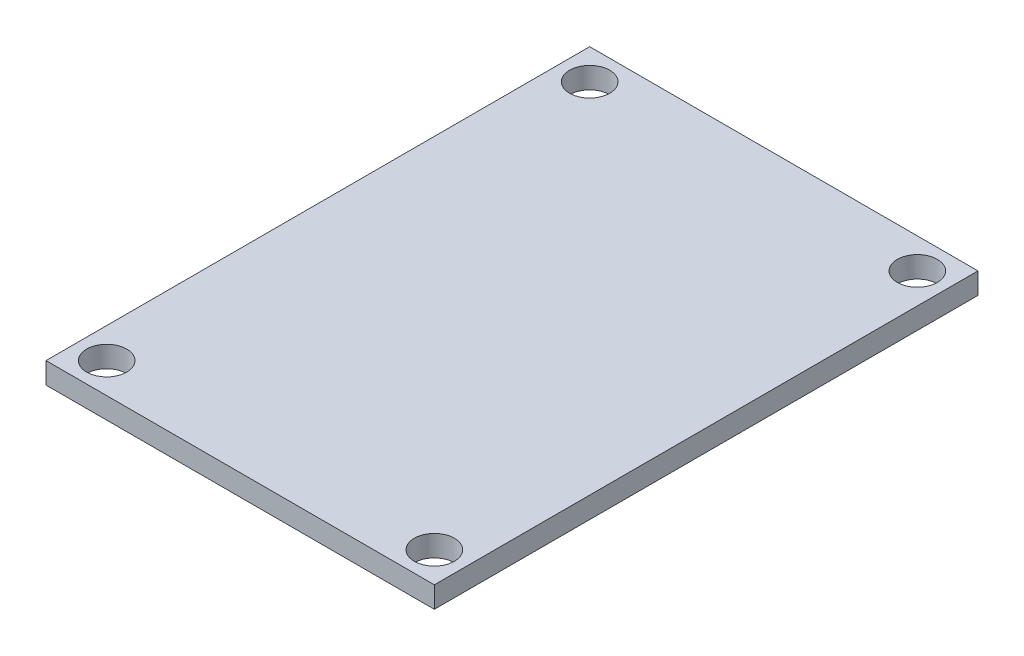
ISO-10303-21;
HEADER;
FILE_DESCRIPTION(('STEP AP214'),'2;1');
FILE_NAME('part.step','',(''),(''),'','','');
FILE_SCHEMA(('AUTOMOTIVE_DESIGN { 1 0 10303 214 1 1 1 1 }'));
ENDSEC;
DATA;
#1=APPLICATION_CONTEXT('core data for automotive mechanical design processes');
#2=APPLICATION_PROTOCOL_DEFINITION('international standard','automotive_design',2000,#1);
#3=PRODUCT_CONTEXT('',#1,'mechanical');
#4=PRODUCT('Part','Part','',(#3));
#5=PRODUCT_RELATED_PRODUCT_CATEGORY('part','',(#4));
#6=PRODUCT_DEFINITION_FORMATION('','',#4);
#7=PRODUCT_DEFINITION_CONTEXT('part definition',#1,'design');
#8=PRODUCT_DEFINITION('design','',#6,#7);
#9=PRODUCT_DEFINITION_SHAPE('','',#8);
#10=(LENGTH_UNIT() NAMED_UNIT(*) SI_UNIT(.MILLI.,.METRE.));
#11=(NAMED_UNIT(*) PLANE_ANGLE_UNIT() SI_UNIT($,.RADIAN.));
#12=(NAMED_UNIT(*) SI_UNIT($,.STERADIAN.) SOLID_ANGLE_UNIT());
#13=UNCERTAINTY_MEASURE_WITH_UNIT(LENGTH_MEASURE(1.E-05),#10,'distance_accuracy_value','');
#14=(GEOMETRIC_REPRESENTATION_CONTEXT(3) GLOBAL_UNCERTAINTY_ASSIGNED_CONTEXT((#13)) GLOBAL_UNIT_ASSIGNED_CONTEXT((#10,
#11,#12)) REPRESENTATION_CONTEXT('',''));
#15=CARTESIAN_POINT('',(0.,0.,0.));
#16=DIRECTION('',(0.,0.,1.));
#17=DIRECTION('',(1.,0.,0.));
#18=AXIS2_PLACEMENT_3D('',#15,#16,#17);
#19=CARTESIAN_POINT('',(0.,1.75,0.));
#20=DIRECTION('',(0.,1.,0.));
#21=DIRECTION('',(0.,0.,1.));
#22=AXIS2_PLACEMENT_3D('',#19,#20,#21);
#23=PLANE('',#22);
#24=CARTESIAN_POINT('',(13.5,1.75,19.9));
#25=DIRECTION('',(0.,1.,0.));
#26=DIRECTION('',(0.,0.,1.));
#27=AXIS2_PLACEMENT_3D('',#24,#25,#26);
#28=CIRCLE('',#27,1.65);
#29=CARTESIAN_POINT('',(13.5,1.75,21.55));
#30=VERTEX_POINT('',#29);
#31=EDGE_CURVE('E127',#30,#30,#28,.T.);
#32=ORIENTED_EDGE('',*,*,#31,.F.);
#33=EDGE_LOOP('',(#32));
#34=FACE_BOUND('',#33,.T.);
#35=CARTESIAN_POINT('',(-13.5,1.75,-19.9));
#36=DIRECTION('',(0.,1.,0.));
#37=DIRECTION('',(0.,0.,1.));
#38=AXIS2_PLACEMENT_3D('',#35,#36,#37);
#39=CIRCLE('',#38,1.65);
#40=CARTESIAN_POINT('',(-13.5,1.75,-18.25));
#41=VERTEX_POINT('',#40);
#42=EDGE_CURVE('E106',#41,#41,#39,.T.);
#43=ORIENTED_EDGE('',*,*,#42,.F.);
#44=EDGE_LOOP('',(#43));
#45=FACE_BOUND('',#44,.T.);
#46=DIRECTION('',(0.,0.,-1.));
#47=VECTOR('',#46,1.);
#48=CARTESIAN_POINT('',(16.,1.75,-22.4));
#49=LINE('',#48,#47);
#50=CARTESIAN_POINT('',(16.,1.75,22.4));
#51=VERTEX_POINT('',#50);
#52=CARTESIAN_POINT('',(16.,1.75,-22.4));
#53=VERTEX_POINT('',#52);
#54=EDGE_CURVE('E91',#51,#53,#49,.T.);
#55=ORIENTED_EDGE('',*,*,#54,.T.);
#56=DIRECTION('',(-1.,0.,0.));
#57=VECTOR('',#56,1.);
#58=CARTESIAN_POINT('',(-16.,1.75,-22.4));
#59=LINE('',#58,#57);
#60=CARTESIAN_POINT('',(-16.,1.75,-22.4));
#61=VERTEX_POINT('',#60);
#62=EDGE_CURVE('E86',#53,#61,#59,.T.);
#63=ORIENTED_EDGE('',*,*,#62,.T.);
#64=DIRECTION('',(0.,0.,1.));
#65=VECTOR('',#64,1.);
#66=CARTESIAN_POINT('',(-16.,1.75,-22.4));
#67=LINE('',#66,#65);
#68=CARTESIAN_POINT('',(-16.,1.75,22.4));
#69=VERTEX_POINT('',#68);
#70=EDGE_CURVE('E89',#61,#69,#67,.T.);
#71=ORIENTED_EDGE('',*,*,#70,.T.);
#72=DIRECTION('',(1.,0.,0.));
#73=VECTOR('',#72,1.);
#74=CARTESIAN_POINT('',(-16.,1.75,22.4));
#75=LINE('',#74,#73);
#76=EDGE_CURVE('E56',#69,#51,#75,.T.);
#77=ORIENTED_EDGE('',*,*,#76,.T.);
#78=EDGE_LOOP('',(#55,#63,#71,#77));
#79=FACE_BOUND('',#78,.T.);
#80=CARTESIAN_POINT('',(13.5,1.75,-19.9));
#81=DIRECTION('',(0.,1.,0.));
#82=DIRECTION('',(0.,0.,-1.));
#83=AXIS2_PLACEMENT_3D('',#80,#81,#82);
#84=CIRCLE('',#83,1.65);
#85=CARTESIAN_POINT('',(13.5,1.75,-21.55));
#86=VERTEX_POINT('',#85);
#87=EDGE_CURVE('E121',#86,#86,#84,.T.);
#88=ORIENTED_EDGE('',*,*,#87,.F.);
#89=EDGE_LOOP('',(#88));
#90=FACE_BOUND('',#89,.T.);
#91=CARTESIAN_POINT('',(-13.5,1.75,19.9));
#92=DIRECTION('',(0.,1.,0.));
#93=DIRECTION('',(0.,0.,-1.));
#94=AXIS2_PLACEMENT_3D('',#91,#92,#93);
#95=CIRCLE('',#94,1.65);
#96=CARTESIAN_POINT('',(-13.5,1.75,18.25));
#97=VERTEX_POINT('',#96);
#98=EDGE_CURVE('E133',#97,#97,#95,.T.);
#99=ORIENTED_EDGE('',*,*,#98,.F.);
#100=EDGE_LOOP('',(#99));
#101=FACE_BOUND('',#100,.T.);
#102=ADVANCED_FACE('F39',(#34,#45,#79,#90,#101),#23,.T.);
#103=CARTESIAN_POINT('',(0.,0.,0.));
#104=DIRECTION('',(0.,1.,0.));
#105=DIRECTION('',(0.,0.,1.));
#106=AXIS2_PLACEMENT_3D('',#103,#104,#105);
#107=PLANE('',#106);
#108=DIRECTION('',(0.,0.,-1.));
#109=VECTOR('',#108,1.);
#110=CARTESIAN_POINT('',(16.,0.,-22.4));
#111=LINE('',#110,#109);
#112=CARTESIAN_POINT('',(16.,0.,22.4));
#113=VERTEX_POINT('',#112);
#114=CARTESIAN_POINT('',(16.,0.,-22.4));
#115=VERTEX_POINT('',#114);
#116=EDGE_CURVE('E103',#113,#115,#111,.T.);
#117=ORIENTED_EDGE('',*,*,#116,.F.);
#118=DIRECTION('',(1.,0.,0.));
#119=VECTOR('',#118,1.);
#120=CARTESIAN_POINT('',(-16.,0.,22.4));
#121=LINE('',#120,#119);
#122=CARTESIAN_POINT('',(-16.,0.,22.4));
#123=VERTEX_POINT('',#122);
#124=EDGE_CURVE('E79',#123,#113,#121,.T.);
#125=ORIENTED_EDGE('',*,*,#124,.F.);
#126=DIRECTION('',(0.,0.,1.));
#127=VECTOR('',#126,1.);
#128=CARTESIAN_POINT('',(-16.,0.,-22.4));
#129=LINE('',#128,#127);
#130=CARTESIAN_POINT('',(-16.,0.,-22.4));
#131=VERTEX_POINT('',#130);
#132=EDGE_CURVE('E73',#131,#123,#129,.T.);
#133=ORIENTED_EDGE('',*,*,#132,.F.);
#134=DIRECTION('',(-1.,0.,0.));
#135=VECTOR('',#134,1.);
#136=CARTESIAN_POINT('',(-16.,0.,-22.4));
#137=LINE('',#136,#135);
#138=EDGE_CURVE('E95',#115,#131,#137,.T.);
#139=ORIENTED_EDGE('',*,*,#138,.F.);
#140=EDGE_LOOP('',(#117,#125,#133,#139));
#141=FACE_BOUND('',#140,.T.);
#142=CARTESIAN_POINT('',(-13.5,0.,-19.9));
#143=DIRECTION('',(0.,1.,0.));
#144=DIRECTION('',(0.,0.,1.));
#145=AXIS2_PLACEMENT_3D('',#142,#143,#144);
#146=CIRCLE('',#145,1.65);
#147=CARTESIAN_POINT('',(-13.5,0.,-18.25));
#148=VERTEX_POINT('',#147);
#149=EDGE_CURVE('E118',#148,#148,#146,.T.);
#150=ORIENTED_EDGE('',*,*,#149,.T.);
#151=EDGE_LOOP('',(#150));
#152=FACE_BOUND('',#151,.T.);
#153=CARTESIAN_POINT('',(13.5,0.,-19.9));
#154=DIRECTION('',(0.,1.,0.));
#155=DIRECTION('',(0.,0.,-1.));
#156=AXIS2_PLACEMENT_3D('',#153,#154,#155);
#157=CIRCLE('',#156,1.65);
#158=CARTESIAN_POINT('',(13.5,0.,-21.55));
#159=VERTEX_POINT('',#158);
#160=EDGE_CURVE('E124',#159,#159,#157,.T.);
#161=ORIENTED_EDGE('',*,*,#160,.T.);
#162=EDGE_LOOP('',(#161));
#163=FACE_BOUND('',#162,.T.);
#164=CARTESIAN_POINT('',(13.5,0.,19.9));
#165=DIRECTION('',(0.,1.,0.));
#166=DIRECTION('',(0.,0.,1.));
#167=AXIS2_PLACEMENT_3D('',#164,#165,#166);
#168=CIRCLE('',#167,1.65);
#169=CARTESIAN_POINT('',(13.5,0.,21.55));
#170=VERTEX_POINT('',#169);
#171=EDGE_CURVE('E130',#170,#170,#168,.T.);
#172=ORIENTED_EDGE('',*,*,#171,.T.);
#173=EDGE_LOOP('',(#172));
#174=FACE_BOUND('',#173,.T.);
#175=CARTESIAN_POINT('',(-13.5,0.,19.9));
#176=DIRECTION('',(0.,1.,0.));
#177=DIRECTION('',(0.,0.,-1.));
#178=AXIS2_PLACEMENT_3D('',#175,#176,#177);
#179=CIRCLE('',#178,1.65);
#180=CARTESIAN_POINT('',(-13.5,0.,18.25));
#181=VERTEX_POINT('',#180);
#182=EDGE_CURVE('E136',#181,#181,#179,.T.);
#183=ORIENTED_EDGE('',*,*,#182,.T.);
#184=EDGE_LOOP('',(#183));
#185=FACE_BOUND('',#184,.T.);
#186=ADVANCED_FACE('F114',(#141,#152,#163,#174,#185),#107,.F.);
#187=CARTESIAN_POINT('',(16.,1.75,-22.4));
#188=DIRECTION('',(-1.,0.,0.));
#189=DIRECTION('',(0.,0.,1.));
#190=AXIS2_PLACEMENT_3D('',#187,#188,#189);
#191=PLANE('',#190);
#192=ORIENTED_EDGE('',*,*,#116,.T.);
#193=DIRECTION('',(0.,-1.,0.));
#194=VECTOR('',#193,1.);
#195=CARTESIAN_POINT('',(16.,1.75,-22.4));
#196=LINE('',#195,#194);
#197=EDGE_CURVE('E11',#53,#115,#196,.T.);
#198=ORIENTED_EDGE('',*,*,#197,.F.);
#199=ORIENTED_EDGE('',*,*,#54,.F.);
#200=DIRECTION('',(0.,-1.,0.));
#201=VECTOR('',#200,1.);
#202=CARTESIAN_POINT('',(16.,1.75,22.4));
#203=LINE('',#202,#201);
#204=EDGE_CURVE('E99',#51,#113,#203,.T.);
#205=ORIENTED_EDGE('',*,*,#204,.T.);
#206=EDGE_LOOP('',(#192,#198,#199,#205));
#207=FACE_BOUND('',#206,.T.);
#208=ADVANCED_FACE('F41',(#207),#191,.F.);
#209=CARTESIAN_POINT('',(-16.,1.75,-22.4));
#210=DIRECTION('',(0.,0.,1.));
#211=DIRECTION('',(1.,0.,0.));
#212=AXIS2_PLACEMENT_3D('',#209,#210,#211);
#213=PLANE('',#212);
#214=ORIENTED_EDGE('',*,*,#138,.T.);
#215=DIRECTION('',(0.,-1.,0.));
#216=VECTOR('',#215,1.);
#217=CARTESIAN_POINT('',(-16.,1.75,-22.4));
#218=LINE('',#217,#216);
#219=EDGE_CURVE('E48',#61,#131,#218,.T.);
#220=ORIENTED_EDGE('',*,*,#219,.F.);
#221=ORIENTED_EDGE('',*,*,#62,.F.);
#222=ORIENTED_EDGE('',*,*,#197,.T.);
#223=EDGE_LOOP('',(#214,#220,#221,#222));
#224=FACE_BOUND('',#223,.T.);
#225=ADVANCED_FACE('F94',(#224),#213,.F.);
#226=CARTESIAN_POINT('',(-16.,1.75,-22.4));
#227=DIRECTION('',(1.,0.,0.));
#228=DIRECTION('',(0.,0.,-1.));
#229=AXIS2_PLACEMENT_3D('',#226,#227,#228);
#230=PLANE('',#229);
#231=ORIENTED_EDGE('',*,*,#132,.T.);
#232=DIRECTION('',(0.,-1.,0.));
#233=VECTOR('',#232,1.);
#234=CARTESIAN_POINT('',(-16.,1.75,22.4));
#235=LINE('',#234,#233);
#236=EDGE_CURVE('E96',#69,#123,#235,.T.);
#237=ORIENTED_EDGE('',*,*,#236,.F.);
#238=ORIENTED_EDGE('',*,*,#70,.F.);
#239=ORIENTED_EDGE('',*,*,#219,.T.);
#240=EDGE_LOOP('',(#231,#237,#238,#239));
#241=FACE_BOUND('',#240,.T.);
#242=ADVANCED_FACE('F97',(#241),#230,.F.);
#243=CARTESIAN_POINT('',(-16.,1.75,22.4));
#244=DIRECTION('',(0.,0.,-1.));
#245=DIRECTION('',(-1.,0.,0.));
#246=AXIS2_PLACEMENT_3D('',#243,#244,#245);
#247=PLANE('',#246);
#248=ORIENTED_EDGE('',*,*,#124,.T.);
#249=ORIENTED_EDGE('',*,*,#204,.F.);
#250=ORIENTED_EDGE('',*,*,#76,.F.);
#251=ORIENTED_EDGE('',*,*,#236,.T.);
#252=EDGE_LOOP('',(#248,#249,#250,#251));
#253=FACE_BOUND('',#252,.T.);
#254=ADVANCED_FACE('F111',(#253),#247,.F.);
#255=CARTESIAN_POINT('',(-13.5,1.75,-19.9));
#256=DIRECTION('',(0.,-1.,0.));
#257=DIRECTION('',(0.,0.,-1.));
#258=AXIS2_PLACEMENT_3D('',#255,#256,#257);
#259=CYLINDRICAL_SURFACE('',#258,1.65);
#260=ORIENTED_EDGE('',*,*,#42,.T.);
#261=EDGE_LOOP('',(#260));
#262=FACE_BOUND('',#261,.T.);
#263=ORIENTED_EDGE('',*,*,#149,.F.);
#264=EDGE_LOOP('',(#263));
#265=FACE_BOUND('',#264,.T.);
#266=ADVANCED_FACE('F155',(#262,#265),#259,.F.);
#267=CARTESIAN_POINT('',(13.5,1.75,-19.9));
#268=DIRECTION('',(0.,-1.,0.));
#269=DIRECTION('',(0.,0.,-1.));
#270=AXIS2_PLACEMENT_3D('',#267,#268,#269);
#271=CYLINDRICAL_SURFACE('',#270,1.65);
#272=ORIENTED_EDGE('',*,*,#87,.T.);
#273=EDGE_LOOP('',(#272));
#274=FACE_BOUND('',#273,.T.);
#275=ORIENTED_EDGE('',*,*,#160,.F.);
#276=EDGE_LOOP('',(#275));
#277=FACE_BOUND('',#276,.T.);
#278=ADVANCED_FACE('F200',(#274,#277),#271,.F.);
#279=CARTESIAN_POINT('',(13.5,1.75,19.9));
#280=DIRECTION('',(0.,-1.,0.));
#281=DIRECTION('',(0.,0.,-1.));
#282=AXIS2_PLACEMENT_3D('',#279,#280,#281);
#283=CYLINDRICAL_SURFACE('',#282,1.65);
#284=ORIENTED_EDGE('',*,*,#31,.T.);
#285=EDGE_LOOP('',(#284));
#286=FACE_BOUND('',#285,.T.);
#287=ORIENTED_EDGE('',*,*,#171,.F.);
#288=EDGE_LOOP('',(#287));
#289=FACE_BOUND('',#288,.T.);
#290=ADVANCED_FACE('F208',(#286,#289),#283,.F.);
#291=CARTESIAN_POINT('',(-13.5,1.75,19.9));
#292=DIRECTION('',(0.,-1.,0.));
#293=DIRECTION('',(0.,0.,-1.));
#294=AXIS2_PLACEMENT_3D('',#291,#292,#293);
#295=CYLINDRICAL_SURFACE('',#294,1.65);
#296=ORIENTED_EDGE('',*,*,#98,.T.);
#297=EDGE_LOOP('',(#296));
#298=FACE_BOUND('',#297,.T.);
#299=ORIENTED_EDGE('',*,*,#182,.F.);
#300=EDGE_LOOP('',(#299));
#301=FACE_BOUND('',#300,.T.);
#302=ADVANCED_FACE('F142',(#298,#301),#295,.F.);
#303=CLOSED_SHELL('',(#102,#186,#208,#225,#242,#254,#266,#278,#290,#302));
#304=MANIFOLD_SOLID_BREP('B2',#303);
#305=ADVANCED_BREP_SHAPE_REPRESENTATION('',(#18,#304),#14);
#306=SHAPE_DEFINITION_REPRESENTATION(#9,#305);
ENDSEC;
END-ISO-10303-21;
